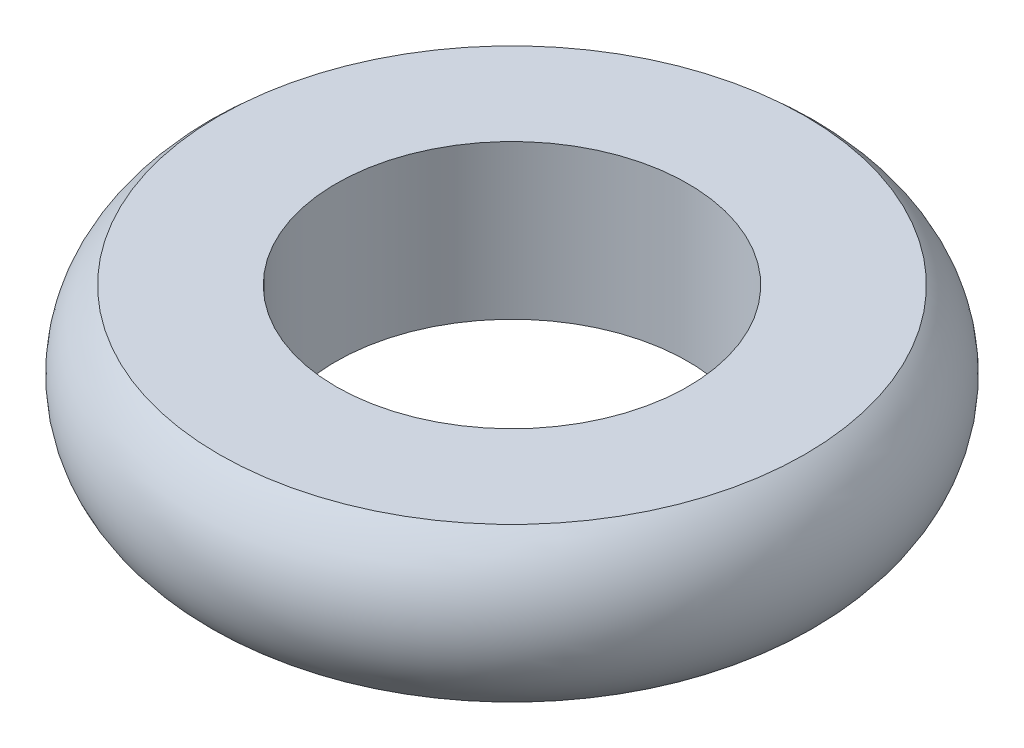
ISO-10303-21;
HEADER;
FILE_DESCRIPTION(('STEP AP214'),'2;1');
FILE_NAME('part.step','',(''),(''),'','','');
FILE_SCHEMA(('AUTOMOTIVE_DESIGN { 1 0 10303 214 1 1 1 1 }'));
ENDSEC;
DATA;
#1=APPLICATION_CONTEXT('core data for automotive mechanical design processes');
#2=APPLICATION_PROTOCOL_DEFINITION('international standard','automotive_design',2000,#1);
#3=PRODUCT_CONTEXT('',#1,'mechanical');
#4=PRODUCT('Part','Part','',(#3));
#5=PRODUCT_RELATED_PRODUCT_CATEGORY('part','',(#4));
#6=PRODUCT_DEFINITION_FORMATION('','',#4);
#7=PRODUCT_DEFINITION_CONTEXT('part definition',#1,'design');
#8=PRODUCT_DEFINITION('design','',#6,#7);
#9=PRODUCT_DEFINITION_SHAPE('','',#8);
#10=(LENGTH_UNIT() NAMED_UNIT(*) SI_UNIT(.MILLI.,.METRE.));
#11=(NAMED_UNIT(*) PLANE_ANGLE_UNIT() SI_UNIT($,.RADIAN.));
#12=(NAMED_UNIT(*) SI_UNIT($,.STERADIAN.) SOLID_ANGLE_UNIT());
#13=UNCERTAINTY_MEASURE_WITH_UNIT(LENGTH_MEASURE(1.E-05),#10,'distance_accuracy_value','');
#14=(GEOMETRIC_REPRESENTATION_CONTEXT(3) GLOBAL_UNCERTAINTY_ASSIGNED_CONTEXT((#13)) GLOBAL_UNIT_ASSIGNED_CONTEXT((#10,
#11,#12)) REPRESENTATION_CONTEXT('',''));
#15=CARTESIAN_POINT('',(0.,0.,0.));
#16=DIRECTION('',(0.,0.,1.));
#17=DIRECTION('',(1.,0.,0.));
#18=AXIS2_PLACEMENT_3D('',#15,#16,#17);
#19=CARTESIAN_POINT('',(0.,0.,0.));
#20=DIRECTION('',(0.,-1.,0.));
#21=DIRECTION('',(0.,0.,-1.));
#22=AXIS2_PLACEMENT_3D('',#19,#20,#21);
#23=TOROIDAL_SURFACE('',#22,2.1,0.9);
#24=CARTESIAN_POINT('',(0.,-0.7,0.));
#25=DIRECTION('',(0.,-1.,0.));
#26=DIRECTION('',(0.,0.,-1.));
#27=AXIS2_PLACEMENT_3D('',#24,#25,#26);
#28=CIRCLE('',#27,2.66568542494924);
#29=CARTESIAN_POINT('',(0.,-0.7,-2.66568542494924));
#30=VERTEX_POINT('',#29);
#31=EDGE_CURVE('E44',#30,#30,#28,.T.);
#32=ORIENTED_EDGE('',*,*,#31,.F.);
#33=EDGE_LOOP('',(#32));
#34=FACE_BOUND('',#33,.T.);
#35=CARTESIAN_POINT('',(0.,0.7,0.));
#36=DIRECTION('',(0.,-1.,0.));
#37=DIRECTION('',(0.,0.,-1.));
#38=AXIS2_PLACEMENT_3D('',#35,#36,#37);
#39=CIRCLE('',#38,2.66568542494924);
#40=CARTESIAN_POINT('',(0.,0.7,-2.66568542494924));
#41=VERTEX_POINT('',#40);
#42=EDGE_CURVE('E10',#41,#41,#39,.T.);
#43=ORIENTED_EDGE('',*,*,#42,.T.);
#44=EDGE_LOOP('',(#43));
#45=FACE_BOUND('',#44,.T.);
#46=ADVANCED_FACE('F36',(#34,#45),#23,.T.);
#47=CARTESIAN_POINT('',(-2.1,-0.7,0.));
#48=DIRECTION('',(0.,1.,0.));
#49=DIRECTION('',(0.,0.,1.));
#50=AXIS2_PLACEMENT_3D('',#47,#48,#49);
#51=PLANE('',#50);
#52=CARTESIAN_POINT('',(0.,-0.7,0.));
#53=DIRECTION('',(0.,1.,0.));
#54=DIRECTION('',(0.,0.,1.));
#55=AXIS2_PLACEMENT_3D('',#52,#53,#54);
#56=CIRCLE('',#55,1.6);
#57=CARTESIAN_POINT('',(0.,-0.7,1.6));
#58=VERTEX_POINT('',#57);
#59=EDGE_CURVE('E49',#58,#58,#56,.T.);
#60=ORIENTED_EDGE('',*,*,#59,.T.);
#61=EDGE_LOOP('',(#60));
#62=FACE_BOUND('',#61,.T.);
#63=ORIENTED_EDGE('',*,*,#31,.T.);
#64=EDGE_LOOP('',(#63));
#65=FACE_BOUND('',#64,.T.);
#66=ADVANCED_FACE('F66',(#62,#65),#51,.F.);
#67=CARTESIAN_POINT('',(-2.1,0.7,0.));
#68=DIRECTION('',(0.,1.,0.));
#69=DIRECTION('',(0.,0.,1.));
#70=AXIS2_PLACEMENT_3D('',#67,#68,#69);
#71=PLANE('',#70);
#72=CARTESIAN_POINT('',(0.,0.7,0.));
#73=DIRECTION('',(0.,1.,0.));
#74=DIRECTION('',(0.,0.,1.));
#75=AXIS2_PLACEMENT_3D('',#72,#73,#74);
#76=CIRCLE('',#75,1.6);
#77=CARTESIAN_POINT('',(0.,0.7,1.6));
#78=VERTEX_POINT('',#77);
#79=EDGE_CURVE('E39',#78,#78,#76,.T.);
#80=ORIENTED_EDGE('',*,*,#79,.F.);
#81=EDGE_LOOP('',(#80));
#82=FACE_BOUND('',#81,.T.);
#83=ORIENTED_EDGE('',*,*,#42,.F.);
#84=EDGE_LOOP('',(#83));
#85=FACE_BOUND('',#84,.T.);
#86=ADVANCED_FACE('F63',(#82,#85),#71,.T.);
#87=CARTESIAN_POINT('',(0.,-3.2,0.));
#88=DIRECTION('',(0.,1.,0.));
#89=DIRECTION('',(0.,0.,1.));
#90=AXIS2_PLACEMENT_3D('',#87,#88,#89);
#91=CYLINDRICAL_SURFACE('',#90,1.6);
#92=ORIENTED_EDGE('',*,*,#79,.T.);
#93=EDGE_LOOP('',(#92));
#94=FACE_BOUND('',#93,.T.);
#95=ORIENTED_EDGE('',*,*,#59,.F.);
#96=EDGE_LOOP('',(#95));
#97=FACE_BOUND('',#96,.T.);
#98=ADVANCED_FACE('F60',(#94,#97),#91,.F.);
#99=CLOSED_SHELL('',(#46,#66,#86,#98));
#100=MANIFOLD_SOLID_BREP('B2',#99);
#101=ADVANCED_BREP_SHAPE_REPRESENTATION('',(#18,#100),#14);
#102=SHAPE_DEFINITION_REPRESENTATION(#9,#101);
ENDSEC;
END-ISO-10303-21;
